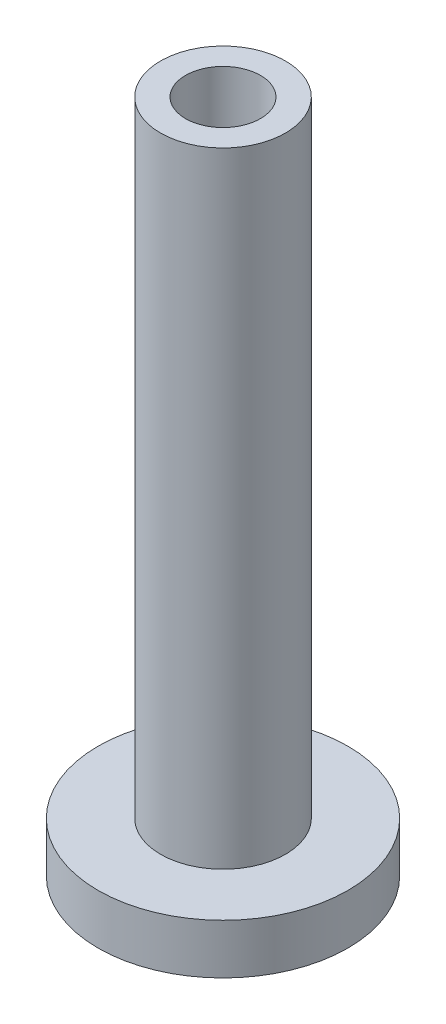
ISO-10303-21;
HEADER;
FILE_DESCRIPTION(('STEP AP214'),'2;1');
FILE_NAME('part.step','',(''),(''),'','','');
FILE_SCHEMA(('AUTOMOTIVE_DESIGN { 1 0 10303 214 1 1 1 1 }'));
ENDSEC;
DATA;
#1=APPLICATION_CONTEXT('core data for automotive mechanical design processes');
#2=APPLICATION_PROTOCOL_DEFINITION('international standard','automotive_design',2000,#1);
#3=PRODUCT_CONTEXT('',#1,'mechanical');
#4=PRODUCT('Part','Part','',(#3));
#5=PRODUCT_RELATED_PRODUCT_CATEGORY('part','',(#4));
#6=PRODUCT_DEFINITION_FORMATION('','',#4);
#7=PRODUCT_DEFINITION_CONTEXT('part definition',#1,'design');
#8=PRODUCT_DEFINITION('design','',#6,#7);
#9=PRODUCT_DEFINITION_SHAPE('','',#8);
#10=(LENGTH_UNIT() NAMED_UNIT(*) SI_UNIT(.MILLI.,.METRE.));
#11=(NAMED_UNIT(*) PLANE_ANGLE_UNIT() SI_UNIT($,.RADIAN.));
#12=(NAMED_UNIT(*) SI_UNIT($,.STERADIAN.) SOLID_ANGLE_UNIT());
#13=UNCERTAINTY_MEASURE_WITH_UNIT(LENGTH_MEASURE(1.E-05),#10,'distance_accuracy_value','');
#14=(GEOMETRIC_REPRESENTATION_CONTEXT(3) GLOBAL_UNCERTAINTY_ASSIGNED_CONTEXT((#13)) GLOBAL_UNIT_ASSIGNED_CONTEXT((#10,
#11,#12)) REPRESENTATION_CONTEXT('',''));
#15=CARTESIAN_POINT('',(0.,0.,0.));
#16=DIRECTION('',(0.,0.,1.));
#17=DIRECTION('',(1.,0.,0.));
#18=AXIS2_PLACEMENT_3D('',#15,#16,#17);
#19=CARTESIAN_POINT('',(0.,-2.,0.));
#20=DIRECTION('',(0.,1.,0.));
#21=DIRECTION('',(0.,0.,1.));
#22=AXIS2_PLACEMENT_3D('',#19,#20,#21);
#23=CYLINDRICAL_SURFACE('',#22,5.);
#24=CARTESIAN_POINT('',(0.,-2.,0.));
#25=DIRECTION('',(0.,1.,0.));
#26=DIRECTION('',(0.,0.,1.));
#27=AXIS2_PLACEMENT_3D('',#24,#25,#26);
#28=CIRCLE('',#27,5.);
#29=CARTESIAN_POINT('',(0.,-2.,5.));
#30=VERTEX_POINT('',#29);
#31=EDGE_CURVE('E43',#30,#30,#28,.T.);
#32=ORIENTED_EDGE('',*,*,#31,.T.);
#33=EDGE_LOOP('',(#32));
#34=FACE_BOUND('',#33,.T.);
#35=CARTESIAN_POINT('',(0.,0.,0.));
#36=DIRECTION('',(0.,1.,0.));
#37=DIRECTION('',(0.,0.,1.));
#38=AXIS2_PLACEMENT_3D('',#35,#36,#37);
#39=CIRCLE('',#38,5.);
#40=CARTESIAN_POINT('',(0.,0.,5.));
#41=VERTEX_POINT('',#40);
#42=EDGE_CURVE('E39',#41,#41,#39,.T.);
#43=ORIENTED_EDGE('',*,*,#42,.F.);
#44=EDGE_LOOP('',(#43));
#45=FACE_BOUND('',#44,.T.);
#46=ADVANCED_FACE('F36',(#34,#45),#23,.T.);
#47=CARTESIAN_POINT('',(0.,-2.,0.));
#48=DIRECTION('',(0.,1.,0.));
#49=DIRECTION('',(0.,0.,1.));
#50=AXIS2_PLACEMENT_3D('',#47,#48,#49);
#51=PLANE('',#50);
#52=ORIENTED_EDGE('',*,*,#31,.F.);
#53=EDGE_LOOP('',(#52));
#54=FACE_BOUND('',#53,.T.);
#55=ADVANCED_FACE('F75',(#54),#51,.F.);
#56=CARTESIAN_POINT('',(0.,0.,0.));
#57=DIRECTION('',(0.,1.,0.));
#58=DIRECTION('',(0.,0.,1.));
#59=AXIS2_PLACEMENT_3D('',#56,#57,#58);
#60=PLANE('',#59);
#61=CARTESIAN_POINT('',(0.,0.,0.));
#62=DIRECTION('',(0.,1.,0.));
#63=DIRECTION('',(0.,0.,1.));
#64=AXIS2_PLACEMENT_3D('',#61,#62,#63);
#65=CIRCLE('',#64,2.5);
#66=CARTESIAN_POINT('',(0.,0.,2.5));
#67=VERTEX_POINT('',#66);
#68=EDGE_CURVE('E10',#67,#67,#65,.T.);
#69=ORIENTED_EDGE('',*,*,#68,.F.);
#70=EDGE_LOOP('',(#69));
#71=FACE_BOUND('',#70,.T.);
#72=ORIENTED_EDGE('',*,*,#42,.T.);
#73=EDGE_LOOP('',(#72));
#74=FACE_BOUND('',#73,.T.);
#75=ADVANCED_FACE('F70',(#71,#74),#60,.T.);
#76=CARTESIAN_POINT('',(0.,25.,0.));
#77=DIRECTION('',(0.,-1.,0.));
#78=DIRECTION('',(0.,0.,-1.));
#79=AXIS2_PLACEMENT_3D('',#76,#77,#78);
#80=CYLINDRICAL_SURFACE('',#79,2.5);
#81=CARTESIAN_POINT('',(0.,25.,0.));
#82=DIRECTION('',(0.,1.,0.));
#83=DIRECTION('',(0.,0.,1.));
#84=AXIS2_PLACEMENT_3D('',#81,#82,#83);
#85=CIRCLE('',#84,2.5);
#86=CARTESIAN_POINT('',(0.,25.,2.5));
#87=VERTEX_POINT('',#86);
#88=EDGE_CURVE('E49',#87,#87,#85,.T.);
#89=ORIENTED_EDGE('',*,*,#88,.F.);
#90=EDGE_LOOP('',(#89));
#91=FACE_BOUND('',#90,.T.);
#92=ORIENTED_EDGE('',*,*,#68,.T.);
#93=EDGE_LOOP('',(#92));
#94=FACE_BOUND('',#93,.T.);
#95=ADVANCED_FACE('F65',(#91,#94),#80,.T.);
#96=CARTESIAN_POINT('',(0.,25.,0.));
#97=DIRECTION('',(0.,1.,0.));
#98=DIRECTION('',(0.,0.,1.));
#99=AXIS2_PLACEMENT_3D('',#96,#97,#98);
#100=PLANE('',#99);
#101=CARTESIAN_POINT('',(0.,25.,0.));
#102=DIRECTION('',(0.,1.,0.));
#103=DIRECTION('',(0.,0.,1.));
#104=AXIS2_PLACEMENT_3D('',#101,#102,#103);
#105=CIRCLE('',#104,1.5);
#106=CARTESIAN_POINT('',(0.,25.,1.5));
#107=VERTEX_POINT('',#106);
#108=EDGE_CURVE('E52',#107,#107,#105,.T.);
#109=ORIENTED_EDGE('',*,*,#108,.F.);
#110=EDGE_LOOP('',(#109));
#111=FACE_BOUND('',#110,.T.);
#112=ORIENTED_EDGE('',*,*,#88,.T.);
#113=EDGE_LOOP('',(#112));
#114=FACE_BOUND('',#113,.T.);
#115=ADVANCED_FACE('F62',(#111,#114),#100,.T.);
#116=CARTESIAN_POINT('',(0.,25.,0.));
#117=DIRECTION('',(0.,-1.,0.));
#118=DIRECTION('',(0.,0.,-1.));
#119=AXIS2_PLACEMENT_3D('',#116,#117,#118);
#120=CYLINDRICAL_SURFACE('',#119,1.5);
#121=ORIENTED_EDGE('',*,*,#108,.T.);
#122=EDGE_LOOP('',(#121));
#123=FACE_BOUND('',#122,.T.);
#124=CARTESIAN_POINT('',(0.,0.,0.));
#125=DIRECTION('',(0.,1.,0.));
#126=DIRECTION('',(0.,0.,1.));
#127=AXIS2_PLACEMENT_3D('',#124,#125,#126);
#128=CIRCLE('',#127,1.5);
#129=CARTESIAN_POINT('',(0.,0.,1.5));
#130=VERTEX_POINT('',#129);
#131=EDGE_CURVE('E53',#130,#130,#128,.T.);
#132=ORIENTED_EDGE('',*,*,#131,.F.);
#133=EDGE_LOOP('',(#132));
#134=FACE_BOUND('',#133,.T.);
#135=ADVANCED_FACE('F59',(#123,#134),#120,.F.);
#136=CARTESIAN_POINT('',(0.,0.,0.));
#137=DIRECTION('',(0.,1.,0.));
#138=DIRECTION('',(0.,0.,1.));
#139=AXIS2_PLACEMENT_3D('',#136,#137,#138);
#140=PLANE('',#139);
#141=ORIENTED_EDGE('',*,*,#131,.T.);
#142=EDGE_LOOP('',(#141));
#143=FACE_BOUND('',#142,.T.);
#144=ADVANCED_FACE('F114',(#143),#140,.T.);
#145=CLOSED_SHELL('',(#46,#55,#75,#95,#115,#135,#144));
#146=MANIFOLD_SOLID_BREP('B2',#145);
#147=ADVANCED_BREP_SHAPE_REPRESENTATION('',(#18,#146),#14);
#148=SHAPE_DEFINITION_REPRESENTATION(#9,#147);
ENDSEC;
END-ISO-10303-21;
